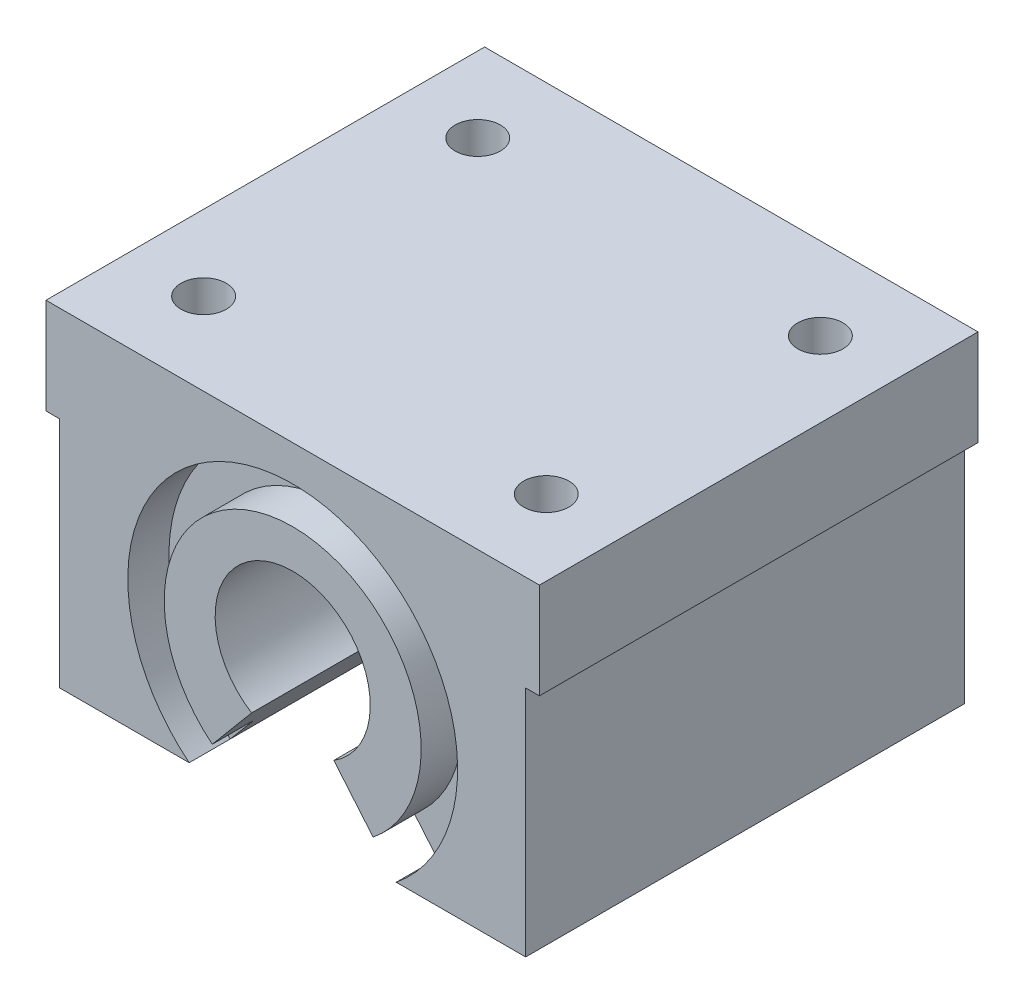
ISO-10303-21;
HEADER;
FILE_DESCRIPTION(('STEP AP214'),'2;1');
FILE_NAME('part.step','',(''),(''),'','','');
FILE_SCHEMA(('AUTOMOTIVE_DESIGN { 1 0 10303 214 1 1 1 1 }'));
ENDSEC;
DATA;
#1=APPLICATION_CONTEXT('core data for automotive mechanical design processes');
#2=APPLICATION_PROTOCOL_DEFINITION('international standard','automotive_design',2000,#1);
#3=PRODUCT_CONTEXT('',#1,'mechanical');
#4=PRODUCT('Part','Part','',(#3));
#5=PRODUCT_RELATED_PRODUCT_CATEGORY('part','',(#4));
#6=PRODUCT_DEFINITION_FORMATION('','',#4);
#7=PRODUCT_DEFINITION_CONTEXT('part definition',#1,'design');
#8=PRODUCT_DEFINITION('design','',#6,#7);
#9=PRODUCT_DEFINITION_SHAPE('','',#8);
#10=(LENGTH_UNIT() NAMED_UNIT(*) SI_UNIT(.MILLI.,.METRE.));
#11=(NAMED_UNIT(*) PLANE_ANGLE_UNIT() SI_UNIT($,.RADIAN.));
#12=(NAMED_UNIT(*) SI_UNIT($,.STERADIAN.) SOLID_ANGLE_UNIT());
#13=UNCERTAINTY_MEASURE_WITH_UNIT(LENGTH_MEASURE(1.E-05),#10,'distance_accuracy_value','');
#14=(GEOMETRIC_REPRESENTATION_CONTEXT(3) GLOBAL_UNCERTAINTY_ASSIGNED_CONTEXT((#13)) GLOBAL_UNIT_ASSIGNED_CONTEXT((#10,
#11,#12)) REPRESENTATION_CONTEXT('',''));
#15=CARTESIAN_POINT('',(0.,0.,0.));
#16=DIRECTION('',(0.,0.,1.));
#17=DIRECTION('',(1.,0.,0.));
#18=AXIS2_PLACEMENT_3D('',#15,#16,#17);
#19=CARTESIAN_POINT('',(0.,-13.7757191330003,16.));
#20=DIRECTION('',(0.,0.,-1.));
#21=DIRECTION('',(-1.,0.,0.));
#22=AXIS2_PLACEMENT_3D('',#19,#20,#21);
#23=PLANE('',#22);
#24=DIRECTION('',(1.,0.,0.));
#25=VECTOR('',#24,1.);
#26=CARTESIAN_POINT('',(-16.9999999999194,-24.,16.));
#27=LINE('',#26,#25);
#28=CARTESIAN_POINT('',(-16.9999999999194,-24.,16.));
#29=VERTEX_POINT('',#28);
#30=CARTESIAN_POINT('',(-7.55189668059617,-24.0000000000009,16.));
#31=VERTEX_POINT('',#30);
#32=EDGE_CURVE('E229',#29,#31,#27,.T.);
#33=ORIENTED_EDGE('',*,*,#32,.T.);
#34=CARTESIAN_POINT('',(-9.13306708578228E-13,-14.6348907764587,16.));
#35=DIRECTION('',(0.,0.,1.));
#36=DIRECTION('',(-1.,0.,0.));
#37=AXIS2_PLACEMENT_3D('',#34,#35,#36);
#38=CIRCLE('',#37,12.0306447974853);
#39=CARTESIAN_POINT('',(7.55189668059544,-24.,16.));
#40=VERTEX_POINT('',#39);
#41=EDGE_CURVE('E247',#40,#31,#38,.T.);
#42=ORIENTED_EDGE('',*,*,#41,.F.);
#43=DIRECTION('',(1.,0.,0.));
#44=VECTOR('',#43,1.);
#45=CARTESIAN_POINT('',(17.,-24.,16.));
#46=LINE('',#45,#44);
#47=CARTESIAN_POINT('',(17.,-24.,16.));
#48=VERTEX_POINT('',#47);
#49=EDGE_CURVE('E243',#40,#48,#46,.T.);
#50=ORIENTED_EDGE('',*,*,#49,.T.);
#51=DIRECTION('',(0.,1.,0.));
#52=VECTOR('',#51,1.);
#53=CARTESIAN_POINT('',(17.,-7.,16.));
#54=LINE('',#53,#52);
#55=CARTESIAN_POINT('',(17.,-7.,16.));
#56=VERTEX_POINT('',#55);
#57=EDGE_CURVE('E140',#48,#56,#54,.T.);
#58=ORIENTED_EDGE('',*,*,#57,.T.);
#59=DIRECTION('',(1.,0.,0.));
#60=VECTOR('',#59,1.);
#61=CARTESIAN_POINT('',(18.,-7.,16.));
#62=LINE('',#61,#60);
#63=CARTESIAN_POINT('',(18.,-7.,16.));
#64=VERTEX_POINT('',#63);
#65=EDGE_CURVE('E133',#56,#64,#62,.T.);
#66=ORIENTED_EDGE('',*,*,#65,.T.);
#67=DIRECTION('',(0.,1.,0.));
#68=VECTOR('',#67,1.);
#69=CARTESIAN_POINT('',(18.,0.,16.));
#70=LINE('',#69,#68);
#71=CARTESIAN_POINT('',(18.,0.,16.));
#72=VERTEX_POINT('',#71);
#73=EDGE_CURVE('E137',#64,#72,#70,.T.);
#74=ORIENTED_EDGE('',*,*,#73,.T.);
#75=DIRECTION('',(-1.,0.,0.));
#76=VECTOR('',#75,1.);
#77=CARTESIAN_POINT('',(-18.,0.,16.));
#78=LINE('',#77,#76);
#79=CARTESIAN_POINT('',(-18.,0.,16.));
#80=VERTEX_POINT('',#79);
#81=EDGE_CURVE('E58',#72,#80,#78,.T.);
#82=ORIENTED_EDGE('',*,*,#81,.T.);
#83=DIRECTION('',(0.,-1.,0.));
#84=VECTOR('',#83,1.);
#85=CARTESIAN_POINT('',(-18.,0.,16.));
#86=LINE('',#85,#84);
#87=CARTESIAN_POINT('',(-18.,-7.,16.));
#88=VERTEX_POINT('',#87);
#89=EDGE_CURVE('E187',#80,#88,#86,.T.);
#90=ORIENTED_EDGE('',*,*,#89,.T.);
#91=DIRECTION('',(1.,0.,0.));
#92=VECTOR('',#91,1.);
#93=CARTESIAN_POINT('',(-18.,-7.,16.));
#94=LINE('',#93,#92);
#95=CARTESIAN_POINT('',(-16.9999999999194,-7.,16.));
#96=VERTEX_POINT('',#95);
#97=EDGE_CURVE('E111',#88,#96,#94,.T.);
#98=ORIENTED_EDGE('',*,*,#97,.T.);
#99=DIRECTION('',(0.,-1.,0.));
#100=VECTOR('',#99,1.);
#101=CARTESIAN_POINT('',(-16.9999999999194,-7.,16.));
#102=LINE('',#101,#100);
#103=EDGE_CURVE('E216',#96,#29,#102,.T.);
#104=ORIENTED_EDGE('',*,*,#103,.T.);
#105=EDGE_LOOP('',(#33,#42,#50,#58,#66,#74,#82,#90,#98,#104));
#106=FACE_BOUND('',#105,.T.);
#107=ADVANCED_FACE('F34',(#106),#23,.F.);
#108=CARTESIAN_POINT('',(-18.,0.,16.));
#109=DIRECTION('',(1.,0.,0.));
#110=DIRECTION('',(0.,1.,0.));
#111=AXIS2_PLACEMENT_3D('',#108,#109,#110);
#112=PLANE('',#111);
#113=DIRECTION('',(0.,-1.,0.));
#114=VECTOR('',#113,1.);
#115=CARTESIAN_POINT('',(-18.,0.,-16.));
#116=LINE('',#115,#114);
#117=CARTESIAN_POINT('',(-18.,0.,-16.));
#118=VERTEX_POINT('',#117);
#119=CARTESIAN_POINT('',(-18.,-7.,-16.));
#120=VERTEX_POINT('',#119);
#121=EDGE_CURVE('E161',#118,#120,#116,.T.);
#122=ORIENTED_EDGE('',*,*,#121,.T.);
#123=DIRECTION('',(0.,0.,-1.));
#124=VECTOR('',#123,1.);
#125=CARTESIAN_POINT('',(-18.,-7.,16.));
#126=LINE('',#125,#124);
#127=EDGE_CURVE('E11',#88,#120,#126,.T.);
#128=ORIENTED_EDGE('',*,*,#127,.F.);
#129=ORIENTED_EDGE('',*,*,#89,.F.);
#130=DIRECTION('',(0.,0.,-1.));
#131=VECTOR('',#130,1.);
#132=CARTESIAN_POINT('',(-18.,0.,16.));
#133=LINE('',#132,#131);
#134=EDGE_CURVE('E157',#80,#118,#133,.T.);
#135=ORIENTED_EDGE('',*,*,#134,.T.);
#136=EDGE_LOOP('',(#122,#128,#129,#135));
#137=FACE_BOUND('',#136,.T.);
#138=ADVANCED_FACE('F36',(#137),#112,.F.);
#139=CARTESIAN_POINT('',(-18.,-7.,16.));
#140=DIRECTION('',(0.,1.,0.));
#141=DIRECTION('',(0.,0.,1.));
#142=AXIS2_PLACEMENT_3D('',#139,#140,#141);
#143=PLANE('',#142);
#144=DIRECTION('',(1.,0.,0.));
#145=VECTOR('',#144,1.);
#146=CARTESIAN_POINT('',(-18.,-7.,-16.));
#147=LINE('',#146,#145);
#148=CARTESIAN_POINT('',(-16.9999999999194,-7.,-16.));
#149=VERTEX_POINT('',#148);
#150=EDGE_CURVE('E164',#120,#149,#147,.T.);
#151=ORIENTED_EDGE('',*,*,#150,.T.);
#152=DIRECTION('',(0.,0.,-1.));
#153=VECTOR('',#152,1.);
#154=CARTESIAN_POINT('',(-16.9999999999194,-7.,16.));
#155=LINE('',#154,#153);
#156=EDGE_CURVE('E42',#96,#149,#155,.T.);
#157=ORIENTED_EDGE('',*,*,#156,.F.);
#158=ORIENTED_EDGE('',*,*,#97,.F.);
#159=ORIENTED_EDGE('',*,*,#127,.T.);
#160=EDGE_LOOP('',(#151,#157,#158,#159));
#161=FACE_BOUND('',#160,.T.);
#162=ADVANCED_FACE('F337',(#161),#143,.F.);
#163=CARTESIAN_POINT('',(-16.9999999999194,-7.,16.));
#164=DIRECTION('',(1.,0.,0.));
#165=DIRECTION('',(0.,0.,-1.));
#166=AXIS2_PLACEMENT_3D('',#163,#164,#165);
#167=PLANE('',#166);
#168=DIRECTION('',(0.,-1.,0.));
#169=VECTOR('',#168,1.);
#170=CARTESIAN_POINT('',(-16.9999999999194,-7.,-16.));
#171=LINE('',#170,#169);
#172=CARTESIAN_POINT('',(-16.9999999999194,-24.,-16.));
#173=VERTEX_POINT('',#172);
#174=EDGE_CURVE('E167',#149,#173,#171,.T.);
#175=ORIENTED_EDGE('',*,*,#174,.T.);
#176=DIRECTION('',(0.,0.,-1.));
#177=VECTOR('',#176,1.);
#178=CARTESIAN_POINT('',(-16.9999999999194,-24.,16.));
#179=LINE('',#178,#177);
#180=EDGE_CURVE('E208',#29,#173,#179,.T.);
#181=ORIENTED_EDGE('',*,*,#180,.F.);
#182=ORIENTED_EDGE('',*,*,#103,.F.);
#183=ORIENTED_EDGE('',*,*,#156,.T.);
#184=EDGE_LOOP('',(#175,#181,#182,#183));
#185=FACE_BOUND('',#184,.T.);
#186=ADVANCED_FACE('F214',(#185),#167,.F.);
#187=CARTESIAN_POINT('',(-16.9999999999194,-24.,16.));
#188=DIRECTION('',(0.,1.,0.));
#189=DIRECTION('',(-1.,0.,0.));
#190=AXIS2_PLACEMENT_3D('',#187,#188,#189);
#191=PLANE('',#190);
#192=DIRECTION('',(1.,0.,0.));
#193=VECTOR('',#192,1.);
#194=CARTESIAN_POINT('',(-16.9999999999194,-24.,-16.));
#195=LINE('',#194,#193);
#196=CARTESIAN_POINT('',(-7.55189668059617,-24.0000000000009,-16.));
#197=VERTEX_POINT('',#196);
#198=EDGE_CURVE('E169',#173,#197,#195,.T.);
#199=ORIENTED_EDGE('',*,*,#198,.T.);
#200=DIRECTION('',(0.,0.,-1.));
#201=VECTOR('',#200,1.);
#202=CARTESIAN_POINT('',(-7.55189668059617,-24.0000000000009,16.));
#203=LINE('',#202,#201);
#204=CARTESIAN_POINT('',(-7.55189668059617,-24.0000000000009,13.));
#205=VERTEX_POINT('',#204);
#206=EDGE_CURVE('E204',#205,#197,#203,.T.);
#207=ORIENTED_EDGE('',*,*,#206,.F.);
#208=EDGE_CURVE('E205',#31,#205,#203,.T.);
#209=ORIENTED_EDGE('',*,*,#208,.F.);
#210=ORIENTED_EDGE('',*,*,#32,.F.);
#211=ORIENTED_EDGE('',*,*,#180,.T.);
#212=EDGE_LOOP('',(#199,#207,#209,#210,#211));
#213=FACE_BOUND('',#212,.T.);
#214=ADVANCED_FACE('F225',(#213),#191,.F.);
#215=CARTESIAN_POINT('',(-3.,-18.5752607777827,16.));
#216=DIRECTION('',(-0.766044443118982,0.642787609686535,0.));
#217=DIRECTION('',(-0.642787609686535,-0.766044443118982,0.));
#218=AXIS2_PLACEMENT_3D('',#215,#216,#217);
#219=PLANE('',#218);
#220=DIRECTION('',(0.642787609686535,0.766044443118982,0.));
#221=VECTOR('',#220,1.);
#222=CARTESIAN_POINT('',(-3.,-18.5752607777827,16.));
#223=LINE('',#222,#221);
#224=CARTESIAN_POINT('',(-5.8661434168187,-21.9909974916666,16.));
#225=VERTEX_POINT('',#224);
#226=CARTESIAN_POINT('',(-3.,-18.5752607777827,16.));
#227=VERTEX_POINT('',#226);
#228=EDGE_CURVE('E232',#225,#227,#223,.T.);
#229=ORIENTED_EDGE('',*,*,#228,.F.);
#230=DIRECTION('',(0.,0.,1.));
#231=VECTOR('',#230,1.);
#232=CARTESIAN_POINT('',(-5.8661434168187,-21.9909974916666,13.));
#233=LINE('',#232,#231);
#234=CARTESIAN_POINT('',(-5.8661434168187,-21.9909974916666,13.));
#235=VERTEX_POINT('',#234);
#236=EDGE_CURVE('E49',#235,#225,#233,.T.);
#237=ORIENTED_EDGE('',*,*,#236,.F.);
#238=DIRECTION('',(0.642787609686535,0.766044443118982,0.));
#239=VECTOR('',#238,1.);
#240=CARTESIAN_POINT('',(-7.55189668059617,-24.0000000000009,13.));
#241=LINE('',#240,#239);
#242=EDGE_CURVE('E274',#205,#235,#241,.T.);
#243=ORIENTED_EDGE('',*,*,#242,.F.);
#244=ORIENTED_EDGE('',*,*,#206,.T.);
#245=DIRECTION('',(0.642787609686535,0.766044443118982,0.));
#246=VECTOR('',#245,1.);
#247=CARTESIAN_POINT('',(-3.,-18.5752607777827,-16.));
#248=LINE('',#247,#246);
#249=CARTESIAN_POINT('',(-3.,-18.5752607777827,-16.));
#250=VERTEX_POINT('',#249);
#251=EDGE_CURVE('E172',#197,#250,#248,.T.);
#252=ORIENTED_EDGE('',*,*,#251,.T.);
#253=DIRECTION('',(0.,0.,-1.));
#254=VECTOR('',#253,1.);
#255=CARTESIAN_POINT('',(-3.,-18.5752607777827,16.));
#256=LINE('',#255,#254);
#257=EDGE_CURVE('E201',#227,#250,#256,.T.);
#258=ORIENTED_EDGE('',*,*,#257,.F.);
#259=EDGE_LOOP('',(#229,#237,#243,#244,#252,#258));
#260=FACE_BOUND('',#259,.T.);
#261=ADVANCED_FACE('F366',(#260),#219,.F.);
#262=CARTESIAN_POINT('',(0.,-13.7757191330003,16.));
#263=DIRECTION('',(0.,0.,-1.));
#264=DIRECTION('',(-1.,0.,0.));
#265=AXIS2_PLACEMENT_3D('',#262,#263,#264);
#266=CYLINDRICAL_SURFACE('',#265,5.66);
#267=CARTESIAN_POINT('',(0.,-13.7757191330003,-16.));
#268=DIRECTION('',(0.,0.,-1.));
#269=DIRECTION('',(-1.,0.,0.));
#270=AXIS2_PLACEMENT_3D('',#267,#268,#269);
#271=CIRCLE('',#270,5.66);
#272=CARTESIAN_POINT('',(3.,-18.5752607777827,-16.));
#273=VERTEX_POINT('',#272);
#274=EDGE_CURVE('E174',#250,#273,#271,.T.);
#275=ORIENTED_EDGE('',*,*,#274,.T.);
#276=DIRECTION('',(0.,0.,-1.));
#277=VECTOR('',#276,1.);
#278=CARTESIAN_POINT('',(3.,-18.5752607777827,16.));
#279=LINE('',#278,#277);
#280=CARTESIAN_POINT('',(3.,-18.5752607777827,16.));
#281=VERTEX_POINT('',#280);
#282=EDGE_CURVE('E198',#281,#273,#279,.T.);
#283=ORIENTED_EDGE('',*,*,#282,.F.);
#284=CARTESIAN_POINT('',(0.,-13.7757191330003,16.));
#285=DIRECTION('',(0.,0.,-1.));
#286=DIRECTION('',(-1.,0.,0.));
#287=AXIS2_PLACEMENT_3D('',#284,#285,#286);
#288=CIRCLE('',#287,5.66);
#289=EDGE_CURVE('E234',#227,#281,#288,.T.);
#290=ORIENTED_EDGE('',*,*,#289,.F.);
#291=ORIENTED_EDGE('',*,*,#257,.T.);
#292=EDGE_LOOP('',(#275,#283,#290,#291));
#293=FACE_BOUND('',#292,.T.);
#294=ADVANCED_FACE('F369',(#293),#266,.F.);
#295=CARTESIAN_POINT('',(3.,-18.5752607777827,16.));
#296=DIRECTION('',(0.766044443118982,0.642787609686535,0.));
#297=DIRECTION('',(-0.642787609686535,0.766044443118981,0.));
#298=AXIS2_PLACEMENT_3D('',#295,#296,#297);
#299=PLANE('',#298);
#300=DIRECTION('',(0.642787609686535,-0.766044443118981,0.));
#301=VECTOR('',#300,1.);
#302=CARTESIAN_POINT('',(5.8661434168187,-21.9909974916666,13.));
#303=LINE('',#302,#301);
#304=CARTESIAN_POINT('',(5.8661434168187,-21.9909974916666,13.));
#305=VERTEX_POINT('',#304);
#306=CARTESIAN_POINT('',(7.55189668059544,-24.,13.));
#307=VERTEX_POINT('',#306);
#308=EDGE_CURVE('E261',#305,#307,#303,.T.);
#309=ORIENTED_EDGE('',*,*,#308,.F.);
#310=DIRECTION('',(0.,0.,1.));
#311=VECTOR('',#310,1.);
#312=CARTESIAN_POINT('',(5.8661434168187,-21.9909974916666,13.));
#313=LINE('',#312,#311);
#314=CARTESIAN_POINT('',(5.8661434168187,-21.9909974916666,16.));
#315=VERTEX_POINT('',#314);
#316=EDGE_CURVE('E165',#305,#315,#313,.T.);
#317=ORIENTED_EDGE('',*,*,#316,.T.);
#318=DIRECTION('',(0.642787609686535,-0.766044443118981,0.));
#319=VECTOR('',#318,1.);
#320=CARTESIAN_POINT('',(3.,-18.5752607777827,16.));
#321=LINE('',#320,#319);
#322=EDGE_CURVE('E240',#281,#315,#321,.T.);
#323=ORIENTED_EDGE('',*,*,#322,.F.);
#324=ORIENTED_EDGE('',*,*,#282,.T.);
#325=DIRECTION('',(0.642787609686535,-0.766044443118981,0.));
#326=VECTOR('',#325,1.);
#327=CARTESIAN_POINT('',(3.,-18.5752607777827,-16.));
#328=LINE('',#327,#326);
#329=CARTESIAN_POINT('',(7.55189668059544,-24.,-16.));
#330=VERTEX_POINT('',#329);
#331=EDGE_CURVE('E176',#273,#330,#328,.T.);
#332=ORIENTED_EDGE('',*,*,#331,.T.);
#333=DIRECTION('',(0.,0.,-1.));
#334=VECTOR('',#333,1.);
#335=CARTESIAN_POINT('',(7.55189668059544,-24.,16.));
#336=LINE('',#335,#334);
#337=EDGE_CURVE('E194',#307,#330,#336,.T.);
#338=ORIENTED_EDGE('',*,*,#337,.F.);
#339=EDGE_LOOP('',(#309,#317,#323,#324,#332,#338));
#340=FACE_BOUND('',#339,.T.);
#341=ADVANCED_FACE('F353',(#340),#299,.F.);
#342=CARTESIAN_POINT('',(17.,-24.,16.));
#343=DIRECTION('',(0.,1.,0.));
#344=DIRECTION('',(0.,0.,1.));
#345=AXIS2_PLACEMENT_3D('',#342,#343,#344);
#346=PLANE('',#345);
#347=DIRECTION('',(1.,0.,0.));
#348=VECTOR('',#347,1.);
#349=CARTESIAN_POINT('',(17.,-24.,-16.));
#350=LINE('',#349,#348);
#351=CARTESIAN_POINT('',(17.,-24.,-16.));
#352=VERTEX_POINT('',#351);
#353=EDGE_CURVE('E179',#330,#352,#350,.T.);
#354=ORIENTED_EDGE('',*,*,#353,.T.);
#355=DIRECTION('',(0.,0.,-1.));
#356=VECTOR('',#355,1.);
#357=CARTESIAN_POINT('',(17.,-24.,16.));
#358=LINE('',#357,#356);
#359=EDGE_CURVE('E191',#48,#352,#358,.T.);
#360=ORIENTED_EDGE('',*,*,#359,.F.);
#361=ORIENTED_EDGE('',*,*,#49,.F.);
#362=EDGE_CURVE('E195',#40,#307,#336,.T.);
#363=ORIENTED_EDGE('',*,*,#362,.T.);
#364=ORIENTED_EDGE('',*,*,#337,.T.);
#365=EDGE_LOOP('',(#354,#360,#361,#363,#364));
#366=FACE_BOUND('',#365,.T.);
#367=ADVANCED_FACE('F249',(#366),#346,.F.);
#368=CARTESIAN_POINT('',(17.,-7.,16.));
#369=DIRECTION('',(-1.,0.,0.));
#370=DIRECTION('',(0.,-1.,0.));
#371=AXIS2_PLACEMENT_3D('',#368,#369,#370);
#372=PLANE('',#371);
#373=DIRECTION('',(0.,1.,0.));
#374=VECTOR('',#373,1.);
#375=CARTESIAN_POINT('',(17.,-7.,-16.));
#376=LINE('',#375,#374);
#377=CARTESIAN_POINT('',(17.,-7.,-16.));
#378=VERTEX_POINT('',#377);
#379=EDGE_CURVE('E181',#352,#378,#376,.T.);
#380=ORIENTED_EDGE('',*,*,#379,.T.);
#381=DIRECTION('',(0.,0.,-1.));
#382=VECTOR('',#381,1.);
#383=CARTESIAN_POINT('',(17.,-7.,16.));
#384=LINE('',#383,#382);
#385=EDGE_CURVE('E152',#56,#378,#384,.T.);
#386=ORIENTED_EDGE('',*,*,#385,.F.);
#387=ORIENTED_EDGE('',*,*,#57,.F.);
#388=ORIENTED_EDGE('',*,*,#359,.T.);
#389=EDGE_LOOP('',(#380,#386,#387,#388));
#390=FACE_BOUND('',#389,.T.);
#391=ADVANCED_FACE('F253',(#390),#372,.F.);
#392=CARTESIAN_POINT('',(18.,-7.,16.));
#393=DIRECTION('',(0.,1.,0.));
#394=DIRECTION('',(0.,0.,1.));
#395=AXIS2_PLACEMENT_3D('',#392,#393,#394);
#396=PLANE('',#395);
#397=DIRECTION('',(1.,0.,0.));
#398=VECTOR('',#397,1.);
#399=CARTESIAN_POINT('',(18.,-7.,-16.));
#400=LINE('',#399,#398);
#401=CARTESIAN_POINT('',(18.,-7.,-16.));
#402=VERTEX_POINT('',#401);
#403=EDGE_CURVE('E149',#378,#402,#400,.T.);
#404=ORIENTED_EDGE('',*,*,#403,.T.);
#405=DIRECTION('',(0.,0.,-1.));
#406=VECTOR('',#405,1.);
#407=CARTESIAN_POINT('',(18.,-7.,16.));
#408=LINE('',#407,#406);
#409=EDGE_CURVE('E146',#64,#402,#408,.T.);
#410=ORIENTED_EDGE('',*,*,#409,.F.);
#411=ORIENTED_EDGE('',*,*,#65,.F.);
#412=ORIENTED_EDGE('',*,*,#385,.T.);
#413=EDGE_LOOP('',(#404,#410,#411,#412));
#414=FACE_BOUND('',#413,.T.);
#415=ADVANCED_FACE('F147',(#414),#396,.F.);
#416=CARTESIAN_POINT('',(18.,0.,16.));
#417=DIRECTION('',(-1.,0.,0.));
#418=DIRECTION('',(0.,0.,1.));
#419=AXIS2_PLACEMENT_3D('',#416,#417,#418);
#420=PLANE('',#419);
#421=DIRECTION('',(0.,1.,0.));
#422=VECTOR('',#421,1.);
#423=CARTESIAN_POINT('',(18.,0.,-16.));
#424=LINE('',#423,#422);
#425=CARTESIAN_POINT('',(18.,0.,-16.));
#426=VERTEX_POINT('',#425);
#427=EDGE_CURVE('E184',#402,#426,#424,.T.);
#428=ORIENTED_EDGE('',*,*,#427,.T.);
#429=DIRECTION('',(0.,0.,-1.));
#430=VECTOR('',#429,1.);
#431=CARTESIAN_POINT('',(18.,0.,16.));
#432=LINE('',#431,#430);
#433=EDGE_CURVE('E153',#72,#426,#432,.T.);
#434=ORIENTED_EDGE('',*,*,#433,.F.);
#435=ORIENTED_EDGE('',*,*,#73,.F.);
#436=ORIENTED_EDGE('',*,*,#409,.T.);
#437=EDGE_LOOP('',(#428,#434,#435,#436));
#438=FACE_BOUND('',#437,.T.);
#439=ADVANCED_FACE('F155',(#438),#420,.F.);
#440=CARTESIAN_POINT('',(-18.,0.,16.));
#441=DIRECTION('',(0.,-1.,0.));
#442=DIRECTION('',(1.,0.,0.));
#443=AXIS2_PLACEMENT_3D('',#440,#441,#442);
#444=PLANE('',#443);
#445=CARTESIAN_POINT('',(12.5,0.,10.));
#446=DIRECTION('',(0.,1.,0.));
#447=DIRECTION('',(0.,0.,1.));
#448=AXIS2_PLACEMENT_3D('',#445,#446,#447);
#449=CIRCLE('',#448,1.64999999999999);
#450=CARTESIAN_POINT('',(12.5,0.,11.65));
#451=VERTEX_POINT('',#450);
#452=EDGE_CURVE('E299',#451,#451,#449,.T.);
#453=ORIENTED_EDGE('',*,*,#452,.F.);
#454=EDGE_LOOP('',(#453));
#455=FACE_BOUND('',#454,.T.);
#456=CARTESIAN_POINT('',(12.5,0.,-10.));
#457=DIRECTION('',(0.,1.,0.));
#458=DIRECTION('',(0.,0.,1.));
#459=AXIS2_PLACEMENT_3D('',#456,#457,#458);
#460=CIRCLE('',#459,1.64999999999999);
#461=CARTESIAN_POINT('',(12.5,0.,-8.35000000000002));
#462=VERTEX_POINT('',#461);
#463=EDGE_CURVE('E293',#462,#462,#460,.T.);
#464=ORIENTED_EDGE('',*,*,#463,.F.);
#465=EDGE_LOOP('',(#464));
#466=FACE_BOUND('',#465,.T.);
#467=CARTESIAN_POINT('',(-12.5,0.,-10.));
#468=DIRECTION('',(0.,1.,0.));
#469=DIRECTION('',(0.,0.,1.));
#470=AXIS2_PLACEMENT_3D('',#467,#468,#469);
#471=CIRCLE('',#470,1.64999999999999);
#472=CARTESIAN_POINT('',(-12.5,0.,-8.35000000000002));
#473=VERTEX_POINT('',#472);
#474=EDGE_CURVE('E287',#473,#473,#471,.T.);
#475=ORIENTED_EDGE('',*,*,#474,.F.);
#476=EDGE_LOOP('',(#475));
#477=FACE_BOUND('',#476,.T.);
#478=CARTESIAN_POINT('',(-12.5,0.,10.));
#479=DIRECTION('',(0.,1.,0.));
#480=DIRECTION('',(0.,0.,1.));
#481=AXIS2_PLACEMENT_3D('',#478,#479,#480);
#482=CIRCLE('',#481,1.64999999999999);
#483=CARTESIAN_POINT('',(-12.5,0.,11.65));
#484=VERTEX_POINT('',#483);
#485=EDGE_CURVE('E281',#484,#484,#482,.T.);
#486=ORIENTED_EDGE('',*,*,#485,.F.);
#487=EDGE_LOOP('',(#486));
#488=FACE_BOUND('',#487,.T.);
#489=DIRECTION('',(-1.,0.,0.));
#490=VECTOR('',#489,1.);
#491=CARTESIAN_POINT('',(-18.,0.,-16.));
#492=LINE('',#491,#490);
#493=EDGE_CURVE('E103',#426,#118,#492,.T.);
#494=ORIENTED_EDGE('',*,*,#493,.T.);
#495=ORIENTED_EDGE('',*,*,#134,.F.);
#496=ORIENTED_EDGE('',*,*,#81,.F.);
#497=ORIENTED_EDGE('',*,*,#433,.T.);
#498=EDGE_LOOP('',(#494,#495,#496,#497));
#499=FACE_BOUND('',#498,.T.);
#500=ADVANCED_FACE('F254',(#455,#466,#477,#488,#499),#444,.F.);
#501=ORIENTED_EDGE('',*,*,#322,.T.);
#502=CARTESIAN_POINT('',(0.,-14.6800548340728,16.));
#503=DIRECTION('',(0.,0.,-1.));
#504=DIRECTION('',(-1.,0.,0.));
#505=AXIS2_PLACEMENT_3D('',#502,#503,#504);
#506=CIRCLE('',#505,9.37344766504355);
#507=EDGE_CURVE('E264',#225,#315,#506,.T.);
#508=ORIENTED_EDGE('',*,*,#507,.F.);
#509=ORIENTED_EDGE('',*,*,#228,.T.);
#510=ORIENTED_EDGE('',*,*,#289,.T.);
#511=EDGE_LOOP('',(#501,#508,#509,#510));
#512=FACE_BOUND('',#511,.T.);
#513=ADVANCED_FACE('F307',(#512),#23,.F.);
#514=CARTESIAN_POINT('',(0.,-13.7757191330003,-16.));
#515=DIRECTION('',(0.,0.,-1.));
#516=DIRECTION('',(-1.,0.,0.));
#517=AXIS2_PLACEMENT_3D('',#514,#515,#516);
#518=PLANE('',#517);
#519=ORIENTED_EDGE('',*,*,#121,.F.);
#520=ORIENTED_EDGE('',*,*,#493,.F.);
#521=ORIENTED_EDGE('',*,*,#427,.F.);
#522=ORIENTED_EDGE('',*,*,#403,.F.);
#523=ORIENTED_EDGE('',*,*,#379,.F.);
#524=ORIENTED_EDGE('',*,*,#353,.F.);
#525=ORIENTED_EDGE('',*,*,#331,.F.);
#526=ORIENTED_EDGE('',*,*,#274,.F.);
#527=ORIENTED_EDGE('',*,*,#251,.F.);
#528=ORIENTED_EDGE('',*,*,#198,.F.);
#529=ORIENTED_EDGE('',*,*,#174,.F.);
#530=ORIENTED_EDGE('',*,*,#150,.F.);
#531=EDGE_LOOP('',(#519,#520,#521,#522,#523,#524,#525,#526,#527,#528,#529,#530));
#532=FACE_BOUND('',#531,.T.);
#533=ADVANCED_FACE('F220',(#532),#518,.T.);
#534=CARTESIAN_POINT('',(-9.13306708578228E-13,-14.6348907764587,13.));
#535=DIRECTION('',(0.,0.,1.));
#536=DIRECTION('',(1.,0.,0.));
#537=AXIS2_PLACEMENT_3D('',#534,#535,#536);
#538=CYLINDRICAL_SURFACE('',#537,12.0306447974853);
#539=ORIENTED_EDGE('',*,*,#41,.T.);
#540=ORIENTED_EDGE('',*,*,#208,.T.);
#541=CARTESIAN_POINT('',(-9.13306708578228E-13,-14.6348907764587,13.));
#542=DIRECTION('',(0.,0.,1.));
#543=DIRECTION('',(-1.,0.,0.));
#544=AXIS2_PLACEMENT_3D('',#541,#542,#543);
#545=CIRCLE('',#544,12.0306447974853);
#546=EDGE_CURVE('E266',#307,#205,#545,.T.);
#547=ORIENTED_EDGE('',*,*,#546,.F.);
#548=ORIENTED_EDGE('',*,*,#362,.F.);
#549=EDGE_LOOP('',(#539,#540,#547,#548));
#550=FACE_BOUND('',#549,.T.);
#551=ADVANCED_FACE('F345',(#550),#538,.F.);
#552=CARTESIAN_POINT('',(0.,-14.6800548340728,13.));
#553=DIRECTION('',(0.,0.,1.));
#554=DIRECTION('',(1.,0.,0.));
#555=AXIS2_PLACEMENT_3D('',#552,#553,#554);
#556=CYLINDRICAL_SURFACE('',#555,9.37344766504355);
#557=ORIENTED_EDGE('',*,*,#507,.T.);
#558=ORIENTED_EDGE('',*,*,#316,.F.);
#559=CARTESIAN_POINT('',(0.,-14.6800548340728,13.));
#560=DIRECTION('',(0.,0.,-1.));
#561=DIRECTION('',(-1.,0.,0.));
#562=AXIS2_PLACEMENT_3D('',#559,#560,#561);
#563=CIRCLE('',#562,9.37344766504355);
#564=EDGE_CURVE('E271',#235,#305,#563,.T.);
#565=ORIENTED_EDGE('',*,*,#564,.F.);
#566=ORIENTED_EDGE('',*,*,#236,.T.);
#567=EDGE_LOOP('',(#557,#558,#565,#566));
#568=FACE_BOUND('',#567,.T.);
#569=ADVANCED_FACE('F358',(#568),#556,.T.);
#570=CARTESIAN_POINT('',(-9.13306708578228E-13,-14.6348907764587,13.));
#571=DIRECTION('',(0.,0.,-1.));
#572=DIRECTION('',(-1.,0.,0.));
#573=AXIS2_PLACEMENT_3D('',#570,#571,#572);
#574=PLANE('',#573);
#575=ORIENTED_EDGE('',*,*,#546,.T.);
#576=ORIENTED_EDGE('',*,*,#242,.T.);
#577=ORIENTED_EDGE('',*,*,#564,.T.);
#578=ORIENTED_EDGE('',*,*,#308,.T.);
#579=EDGE_LOOP('',(#575,#576,#577,#578));
#580=FACE_BOUND('',#579,.T.);
#581=ADVANCED_FACE('F328',(#580),#574,.F.);
#582=CARTESIAN_POINT('',(-12.5,-10.,10.));
#583=DIRECTION('',(0.,1.,0.));
#584=DIRECTION('',(0.,0.,1.));
#585=AXIS2_PLACEMENT_3D('',#582,#583,#584);
#586=CONICAL_SURFACE('',#585,1.65,1.02974425867665);
#587=CARTESIAN_POINT('',(-12.5,-10.9914200213955,10.));
#588=VERTEX_POINT('',#587);
#589=VERTEX_LOOP('',#588);
#590=FACE_BOUND('',#589,.T.);
#591=CARTESIAN_POINT('',(-12.5,-10.,10.));
#592=DIRECTION('',(0.,1.,0.));
#593=DIRECTION('',(0.,0.,1.));
#594=AXIS2_PLACEMENT_3D('',#591,#592,#593);
#595=CIRCLE('',#594,1.65);
#596=CARTESIAN_POINT('',(-12.5,-10.,11.65));
#597=VERTEX_POINT('',#596);
#598=EDGE_CURVE('E268',#597,#597,#595,.T.);
#599=ORIENTED_EDGE('',*,*,#598,.T.);
#600=EDGE_LOOP('',(#599));
#601=FACE_BOUND('',#600,.T.);
#602=ADVANCED_FACE('F318',(#590,#601),#586,.F.);
#603=CARTESIAN_POINT('',(-12.5,0.,10.));
#604=DIRECTION('',(0.,1.,0.));
#605=DIRECTION('',(0.,0.,1.));
#606=AXIS2_PLACEMENT_3D('',#603,#604,#605);
#607=CYLINDRICAL_SURFACE('',#606,1.64999999999999);
#608=ORIENTED_EDGE('',*,*,#598,.F.);
#609=EDGE_LOOP('',(#608));
#610=FACE_BOUND('',#609,.T.);
#611=ORIENTED_EDGE('',*,*,#485,.T.);
#612=EDGE_LOOP('',(#611));
#613=FACE_BOUND('',#612,.T.);
#614=ADVANCED_FACE('F315',(#610,#613),#607,.F.);
#615=CARTESIAN_POINT('',(-12.5,-10.,-10.));
#616=DIRECTION('',(0.,1.,0.));
#617=DIRECTION('',(0.,0.,1.));
#618=AXIS2_PLACEMENT_3D('',#615,#616,#617);
#619=CONICAL_SURFACE('',#618,1.65,1.02974425867665);
#620=CARTESIAN_POINT('',(-12.5,-10.9914200213955,-10.));
#621=VERTEX_POINT('',#620);
#622=VERTEX_LOOP('',#621);
#623=FACE_BOUND('',#622,.T.);
#624=CARTESIAN_POINT('',(-12.5,-10.,-10.));
#625=DIRECTION('',(0.,1.,0.));
#626=DIRECTION('',(0.,0.,1.));
#627=AXIS2_PLACEMENT_3D('',#624,#625,#626);
#628=CIRCLE('',#627,1.65);
#629=CARTESIAN_POINT('',(-12.5,-10.,-8.35000000000001));
#630=VERTEX_POINT('',#629);
#631=EDGE_CURVE('E284',#630,#630,#628,.T.);
#632=ORIENTED_EDGE('',*,*,#631,.T.);
#633=EDGE_LOOP('',(#632));
#634=FACE_BOUND('',#633,.T.);
#635=ADVANCED_FACE('F317',(#623,#634),#619,.F.);
#636=CARTESIAN_POINT('',(-12.5,0.,-10.));
#637=DIRECTION('',(0.,1.,0.));
#638=DIRECTION('',(0.,0.,1.));
#639=AXIS2_PLACEMENT_3D('',#636,#637,#638);
#640=CYLINDRICAL_SURFACE('',#639,1.64999999999999);
#641=ORIENTED_EDGE('',*,*,#631,.F.);
#642=EDGE_LOOP('',(#641));
#643=FACE_BOUND('',#642,.T.);
#644=ORIENTED_EDGE('',*,*,#474,.T.);
#645=EDGE_LOOP('',(#644));
#646=FACE_BOUND('',#645,.T.);
#647=ADVANCED_FACE('F325',(#643,#646),#640,.F.);
#648=CARTESIAN_POINT('',(12.5,-10.,-10.));
#649=DIRECTION('',(0.,1.,0.));
#650=DIRECTION('',(0.,0.,1.));
#651=AXIS2_PLACEMENT_3D('',#648,#649,#650);
#652=CONICAL_SURFACE('',#651,1.65,1.02974425867665);
#653=CARTESIAN_POINT('',(12.5,-10.9914200213955,-10.));
#654=VERTEX_POINT('',#653);
#655=VERTEX_LOOP('',#654);
#656=FACE_BOUND('',#655,.T.);
#657=CARTESIAN_POINT('',(12.5,-10.,-10.));
#658=DIRECTION('',(0.,1.,0.));
#659=DIRECTION('',(0.,0.,1.));
#660=AXIS2_PLACEMENT_3D('',#657,#658,#659);
#661=CIRCLE('',#660,1.65);
#662=CARTESIAN_POINT('',(12.5,-10.,-8.35000000000001));
#663=VERTEX_POINT('',#662);
#664=EDGE_CURVE('E290',#663,#663,#661,.T.);
#665=ORIENTED_EDGE('',*,*,#664,.T.);
#666=EDGE_LOOP('',(#665));
#667=FACE_BOUND('',#666,.T.);
#668=ADVANCED_FACE('F402',(#656,#667),#652,.F.);
#669=CARTESIAN_POINT('',(12.5,0.,-10.));
#670=DIRECTION('',(0.,1.,0.));
#671=DIRECTION('',(0.,0.,1.));
#672=AXIS2_PLACEMENT_3D('',#669,#670,#671);
#673=CYLINDRICAL_SURFACE('',#672,1.64999999999999);
#674=ORIENTED_EDGE('',*,*,#664,.F.);
#675=EDGE_LOOP('',(#674));
#676=FACE_BOUND('',#675,.T.);
#677=ORIENTED_EDGE('',*,*,#463,.T.);
#678=EDGE_LOOP('',(#677));
#679=FACE_BOUND('',#678,.T.);
#680=ADVANCED_FACE('F391',(#676,#679),#673,.F.);
#681=CARTESIAN_POINT('',(12.5,-10.,10.));
#682=DIRECTION('',(0.,1.,0.));
#683=DIRECTION('',(0.,0.,1.));
#684=AXIS2_PLACEMENT_3D('',#681,#682,#683);
#685=CONICAL_SURFACE('',#684,1.65,1.02974425867665);
#686=CARTESIAN_POINT('',(12.5,-10.9914200213955,10.));
#687=VERTEX_POINT('',#686);
#688=VERTEX_LOOP('',#687);
#689=FACE_BOUND('',#688,.T.);
#690=CARTESIAN_POINT('',(12.5,-10.,10.));
#691=DIRECTION('',(0.,1.,0.));
#692=DIRECTION('',(0.,0.,1.));
#693=AXIS2_PLACEMENT_3D('',#690,#691,#692);
#694=CIRCLE('',#693,1.65);
#695=CARTESIAN_POINT('',(12.5,-10.,11.65));
#696=VERTEX_POINT('',#695);
#697=EDGE_CURVE('E296',#696,#696,#694,.T.);
#698=ORIENTED_EDGE('',*,*,#697,.T.);
#699=EDGE_LOOP('',(#698));
#700=FACE_BOUND('',#699,.T.);
#701=ADVANCED_FACE('F388',(#689,#700),#685,.F.);
#702=CARTESIAN_POINT('',(12.5,0.,10.));
#703=DIRECTION('',(0.,1.,0.));
#704=DIRECTION('',(0.,0.,1.));
#705=AXIS2_PLACEMENT_3D('',#702,#703,#704);
#706=CYLINDRICAL_SURFACE('',#705,1.64999999999999);
#707=ORIENTED_EDGE('',*,*,#697,.F.);
#708=EDGE_LOOP('',(#707));
#709=FACE_BOUND('',#708,.T.);
#710=ORIENTED_EDGE('',*,*,#452,.T.);
#711=EDGE_LOOP('',(#710));
#712=FACE_BOUND('',#711,.T.);
#713=ADVANCED_FACE('F303',(#709,#712),#706,.F.);
#714=CLOSED_SHELL('',(#107,#138,#162,#186,#214,#261,#294,#341,#367,#391,#415,#439,#500,#513,
#533,#551,#569,#581,#602,#614,#635,#647,#668,#680,#701,#713));
#715=MANIFOLD_SOLID_BREP('B2',#714);
#716=ADVANCED_BREP_SHAPE_REPRESENTATION('',(#18,#715),#14);
#717=SHAPE_DEFINITION_REPRESENTATION(#9,#716);
ENDSEC;
END-ISO-10303-21;
